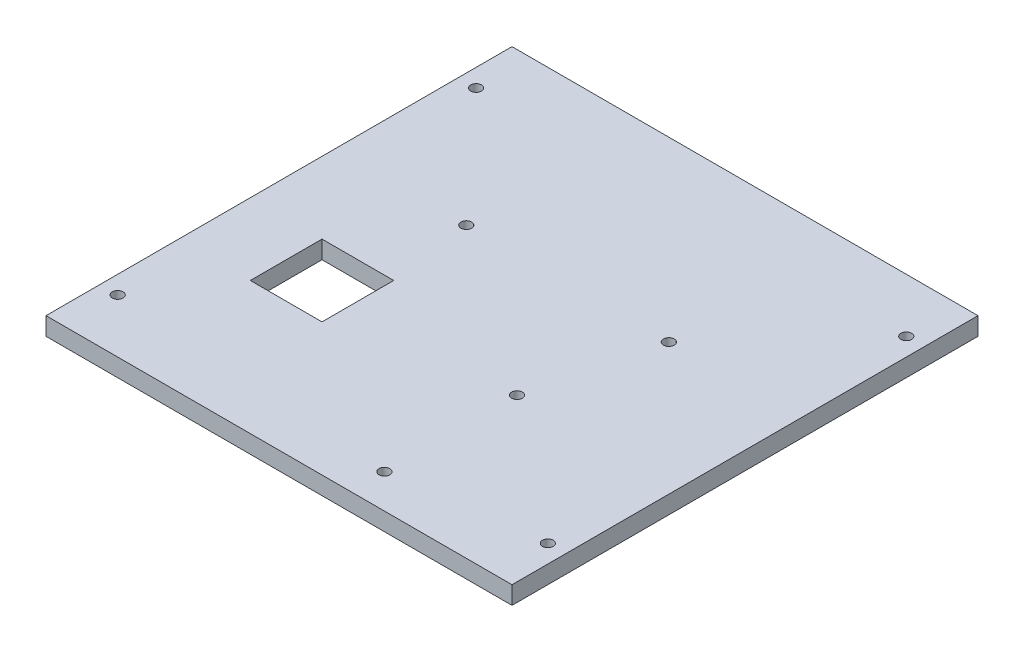
ISO-10303-21;
HEADER;
FILE_DESCRIPTION(('STEP AP214'),'2;1');
FILE_NAME('part.step','',(''),(''),'','','');
FILE_SCHEMA(('AUTOMOTIVE_DESIGN { 1 0 10303 214 1 1 1 1 }'));
ENDSEC;
DATA;
#1=APPLICATION_CONTEXT('core data for automotive mechanical design processes');
#2=APPLICATION_PROTOCOL_DEFINITION('international standard','automotive_design',2000,#1);
#3=PRODUCT_CONTEXT('',#1,'mechanical');
#4=PRODUCT('Part','Part','',(#3));
#5=PRODUCT_RELATED_PRODUCT_CATEGORY('part','',(#4));
#6=PRODUCT_DEFINITION_FORMATION('','',#4);
#7=PRODUCT_DEFINITION_CONTEXT('part definition',#1,'design');
#8=PRODUCT_DEFINITION('design','',#6,#7);
#9=PRODUCT_DEFINITION_SHAPE('','',#8);
#10=(LENGTH_UNIT() NAMED_UNIT(*) SI_UNIT(.MILLI.,.METRE.));
#11=(NAMED_UNIT(*) PLANE_ANGLE_UNIT() SI_UNIT($,.RADIAN.));
#12=(NAMED_UNIT(*) SI_UNIT($,.STERADIAN.) SOLID_ANGLE_UNIT());
#13=UNCERTAINTY_MEASURE_WITH_UNIT(LENGTH_MEASURE(1.E-05),#10,'distance_accuracy_value','');
#14=(GEOMETRIC_REPRESENTATION_CONTEXT(3) GLOBAL_UNCERTAINTY_ASSIGNED_CONTEXT((#13)) GLOBAL_UNIT_ASSIGNED_CONTEXT((#10,
#11,#12)) REPRESENTATION_CONTEXT('',''));
#15=CARTESIAN_POINT('',(0.,0.,0.));
#16=DIRECTION('',(0.,0.,1.));
#17=DIRECTION('',(1.,0.,0.));
#18=AXIS2_PLACEMENT_3D('',#15,#16,#17);
#19=CARTESIAN_POINT('',(65.,5.,-65.));
#20=DIRECTION('',(-1.,0.,0.));
#21=DIRECTION('',(0.,0.,1.));
#22=AXIS2_PLACEMENT_3D('',#19,#20,#21);
#23=PLANE('',#22);
#24=DIRECTION('',(0.,0.,-1.));
#25=VECTOR('',#24,1.);
#26=CARTESIAN_POINT('',(65.,0.,-65.));
#27=LINE('',#26,#25);
#28=CARTESIAN_POINT('',(65.,0.,65.));
#29=VERTEX_POINT('',#28);
#30=CARTESIAN_POINT('',(65.,0.,-65.));
#31=VERTEX_POINT('',#30);
#32=EDGE_CURVE('E172',#29,#31,#27,.T.);
#33=ORIENTED_EDGE('',*,*,#32,.T.);
#34=DIRECTION('',(0.,-1.,0.));
#35=VECTOR('',#34,1.);
#36=CARTESIAN_POINT('',(65.,5.,-65.));
#37=LINE('',#36,#35);
#38=CARTESIAN_POINT('',(65.,5.,-65.));
#39=VERTEX_POINT('',#38);
#40=EDGE_CURVE('E11',#39,#31,#37,.T.);
#41=ORIENTED_EDGE('',*,*,#40,.F.);
#42=DIRECTION('',(0.,0.,-1.));
#43=VECTOR('',#42,1.);
#44=CARTESIAN_POINT('',(65.,5.,-65.));
#45=LINE('',#44,#43);
#46=CARTESIAN_POINT('',(65.,5.,65.));
#47=VERTEX_POINT('',#46);
#48=EDGE_CURVE('E177',#47,#39,#45,.T.);
#49=ORIENTED_EDGE('',*,*,#48,.F.);
#50=DIRECTION('',(0.,-1.,0.));
#51=VECTOR('',#50,1.);
#52=CARTESIAN_POINT('',(65.,5.,65.));
#53=LINE('',#52,#51);
#54=EDGE_CURVE('E187',#47,#29,#53,.T.);
#55=ORIENTED_EDGE('',*,*,#54,.T.);
#56=EDGE_LOOP('',(#33,#41,#49,#55));
#57=FACE_BOUND('',#56,.T.);
#58=ADVANCED_FACE('F33',(#57),#23,.F.);
#59=CARTESIAN_POINT('',(-65.,5.,-65.));
#60=DIRECTION('',(0.,0.,1.));
#61=DIRECTION('',(1.,0.,0.));
#62=AXIS2_PLACEMENT_3D('',#59,#60,#61);
#63=PLANE('',#62);
#64=DIRECTION('',(-1.,0.,0.));
#65=VECTOR('',#64,1.);
#66=CARTESIAN_POINT('',(-65.,0.,-65.));
#67=LINE('',#66,#65);
#68=CARTESIAN_POINT('',(-65.,0.,-65.));
#69=VERTEX_POINT('',#68);
#70=EDGE_CURVE('E190',#31,#69,#67,.T.);
#71=ORIENTED_EDGE('',*,*,#70,.T.);
#72=DIRECTION('',(0.,-1.,0.));
#73=VECTOR('',#72,1.);
#74=CARTESIAN_POINT('',(-65.,5.,-65.));
#75=LINE('',#74,#73);
#76=CARTESIAN_POINT('',(-65.,5.,-65.));
#77=VERTEX_POINT('',#76);
#78=EDGE_CURVE('E40',#77,#69,#75,.T.);
#79=ORIENTED_EDGE('',*,*,#78,.F.);
#80=DIRECTION('',(-1.,0.,0.));
#81=VECTOR('',#80,1.);
#82=CARTESIAN_POINT('',(-65.,5.,-65.));
#83=LINE('',#82,#81);
#84=EDGE_CURVE('E180',#39,#77,#83,.T.);
#85=ORIENTED_EDGE('',*,*,#84,.F.);
#86=ORIENTED_EDGE('',*,*,#40,.T.);
#87=EDGE_LOOP('',(#71,#79,#85,#86));
#88=FACE_BOUND('',#87,.T.);
#89=ADVANCED_FACE('F219',(#88),#63,.F.);
#90=CARTESIAN_POINT('',(-65.,5.,-65.));
#91=DIRECTION('',(1.,0.,0.));
#92=DIRECTION('',(0.,0.,-1.));
#93=AXIS2_PLACEMENT_3D('',#90,#91,#92);
#94=PLANE('',#93);
#95=DIRECTION('',(0.,0.,1.));
#96=VECTOR('',#95,1.);
#97=CARTESIAN_POINT('',(-65.,0.,-65.));
#98=LINE('',#97,#96);
#99=CARTESIAN_POINT('',(-65.,0.,65.));
#100=VERTEX_POINT('',#99);
#101=EDGE_CURVE('E192',#69,#100,#98,.T.);
#102=ORIENTED_EDGE('',*,*,#101,.T.);
#103=DIRECTION('',(0.,-1.,0.));
#104=VECTOR('',#103,1.);
#105=CARTESIAN_POINT('',(-65.,5.,65.));
#106=LINE('',#105,#104);
#107=CARTESIAN_POINT('',(-65.,5.,65.));
#108=VERTEX_POINT('',#107);
#109=EDGE_CURVE('E197',#108,#100,#106,.T.);
#110=ORIENTED_EDGE('',*,*,#109,.F.);
#111=DIRECTION('',(0.,0.,1.));
#112=VECTOR('',#111,1.);
#113=CARTESIAN_POINT('',(-65.,5.,-65.));
#114=LINE('',#113,#112);
#115=EDGE_CURVE('E183',#77,#108,#114,.T.);
#116=ORIENTED_EDGE('',*,*,#115,.F.);
#117=ORIENTED_EDGE('',*,*,#78,.T.);
#118=EDGE_LOOP('',(#102,#110,#116,#117));
#119=FACE_BOUND('',#118,.T.);
#120=ADVANCED_FACE('F204',(#119),#94,.F.);
#121=CARTESIAN_POINT('',(-65.,5.,65.));
#122=DIRECTION('',(0.,0.,-1.));
#123=DIRECTION('',(-1.,0.,0.));
#124=AXIS2_PLACEMENT_3D('',#121,#122,#123);
#125=PLANE('',#124);
#126=DIRECTION('',(1.,0.,0.));
#127=VECTOR('',#126,1.);
#128=CARTESIAN_POINT('',(-65.,0.,65.));
#129=LINE('',#128,#127);
#130=EDGE_CURVE('E181',#100,#29,#129,.T.);
#131=ORIENTED_EDGE('',*,*,#130,.T.);
#132=ORIENTED_EDGE('',*,*,#54,.F.);
#133=DIRECTION('',(1.,0.,0.));
#134=VECTOR('',#133,1.);
#135=CARTESIAN_POINT('',(-65.,5.,65.));
#136=LINE('',#135,#134);
#137=EDGE_CURVE('E185',#108,#47,#136,.T.);
#138=ORIENTED_EDGE('',*,*,#137,.F.);
#139=ORIENTED_EDGE('',*,*,#109,.T.);
#140=EDGE_LOOP('',(#131,#132,#138,#139));
#141=FACE_BOUND('',#140,.T.);
#142=ADVANCED_FACE('F213',(#141),#125,.F.);
#143=CARTESIAN_POINT('',(0.,5.,0.));
#144=DIRECTION('',(0.,1.,0.));
#145=DIRECTION('',(0.,0.,1.));
#146=AXIS2_PLACEMENT_3D('',#143,#144,#145);
#147=PLANE('',#146);
#148=DIRECTION('',(0.,0.,-1.));
#149=VECTOR('',#148,1.);
#150=CARTESIAN_POINT('',(-25.,5.,8.));
#151=LINE('',#150,#149);
#152=CARTESIAN_POINT('',(-25.,5.,28.));
#153=VERTEX_POINT('',#152);
#154=CARTESIAN_POINT('',(-25.,5.,8.));
#155=VERTEX_POINT('',#154);
#156=EDGE_CURVE('E47',#153,#155,#151,.T.);
#157=ORIENTED_EDGE('',*,*,#156,.F.);
#158=DIRECTION('',(1.,0.,0.));
#159=VECTOR('',#158,1.);
#160=CARTESIAN_POINT('',(-45.,5.,28.));
#161=LINE('',#160,#159);
#162=CARTESIAN_POINT('',(-45.,5.,28.));
#163=VERTEX_POINT('',#162);
#164=EDGE_CURVE('E116',#163,#153,#161,.T.);
#165=ORIENTED_EDGE('',*,*,#164,.F.);
#166=DIRECTION('',(0.,0.,1.));
#167=VECTOR('',#166,1.);
#168=CARTESIAN_POINT('',(-45.,5.,8.));
#169=LINE('',#168,#167);
#170=CARTESIAN_POINT('',(-45.,5.,8.));
#171=VERTEX_POINT('',#170);
#172=EDGE_CURVE('E100',#171,#163,#169,.T.);
#173=ORIENTED_EDGE('',*,*,#172,.F.);
#174=DIRECTION('',(-1.,0.,0.));
#175=VECTOR('',#174,1.);
#176=CARTESIAN_POINT('',(-45.,5.,8.));
#177=LINE('',#176,#175);
#178=EDGE_CURVE('E109',#155,#171,#177,.T.);
#179=ORIENTED_EDGE('',*,*,#178,.F.);
#180=EDGE_LOOP('',(#157,#165,#173,#179));
#181=FACE_BOUND('',#180,.T.);
#182=CARTESIAN_POINT('',(-60.,5.,-50.));
#183=DIRECTION('',(0.,1.,0.));
#184=DIRECTION('',(0.,0.,1.));
#185=AXIS2_PLACEMENT_3D('',#182,#183,#184);
#186=CIRCLE('',#185,1.5);
#187=CARTESIAN_POINT('',(-60.,5.,-48.5));
#188=VERTEX_POINT('',#187);
#189=EDGE_CURVE('E135',#188,#188,#186,.T.);
#190=ORIENTED_EDGE('',*,*,#189,.F.);
#191=EDGE_LOOP('',(#190));
#192=FACE_BOUND('',#191,.T.);
#193=CARTESIAN_POINT('',(60.,5.,50.));
#194=DIRECTION('',(0.,1.,0.));
#195=DIRECTION('',(0.,0.,1.));
#196=AXIS2_PLACEMENT_3D('',#193,#194,#195);
#197=CIRCLE('',#196,1.5);
#198=CARTESIAN_POINT('',(60.,5.,51.5));
#199=VERTEX_POINT('',#198);
#200=EDGE_CURVE('E134',#199,#199,#197,.T.);
#201=ORIENTED_EDGE('',*,*,#200,.F.);
#202=EDGE_LOOP('',(#201));
#203=FACE_BOUND('',#202,.T.);
#204=CARTESIAN_POINT('',(-60.,5.,50.));
#205=DIRECTION('',(0.,1.,0.));
#206=DIRECTION('',(0.,0.,-1.));
#207=AXIS2_PLACEMENT_3D('',#204,#205,#206);
#208=CIRCLE('',#207,1.5);
#209=CARTESIAN_POINT('',(-60.,5.,48.5));
#210=VERTEX_POINT('',#209);
#211=EDGE_CURVE('E127',#210,#210,#208,.T.);
#212=ORIENTED_EDGE('',*,*,#211,.F.);
#213=EDGE_LOOP('',(#212));
#214=FACE_BOUND('',#213,.T.);
#215=CARTESIAN_POINT('',(60.,5.,-50.));
#216=DIRECTION('',(0.,1.,0.));
#217=DIRECTION('',(0.,0.,-1.));
#218=AXIS2_PLACEMENT_3D('',#215,#216,#217);
#219=CIRCLE('',#218,1.5);
#220=CARTESIAN_POINT('',(60.,5.,-51.5));
#221=VERTEX_POINT('',#220);
#222=EDGE_CURVE('E142',#221,#221,#219,.T.);
#223=ORIENTED_EDGE('',*,*,#222,.F.);
#224=EDGE_LOOP('',(#223));
#225=FACE_BOUND('',#224,.T.);
#226=CARTESIAN_POINT('',(-28.25,5.,-15.5));
#227=DIRECTION('',(0.,1.,0.));
#228=DIRECTION('',(0.,0.,1.));
#229=AXIS2_PLACEMENT_3D('',#226,#227,#228);
#230=CIRCLE('',#229,1.5);
#231=CARTESIAN_POINT('',(-28.25,5.,-14.));
#232=VERTEX_POINT('',#231);
#233=EDGE_CURVE('E153',#232,#232,#230,.T.);
#234=ORIENTED_EDGE('',*,*,#233,.F.);
#235=EDGE_LOOP('',(#234));
#236=FACE_BOUND('',#235,.T.);
#237=CARTESIAN_POINT('',(28.25,5.,-15.5));
#238=DIRECTION('',(0.,1.,0.));
#239=DIRECTION('',(0.,0.,1.));
#240=AXIS2_PLACEMENT_3D('',#237,#238,#239);
#241=CIRCLE('',#240,1.5);
#242=CARTESIAN_POINT('',(28.25,5.,-14.));
#243=VERTEX_POINT('',#242);
#244=EDGE_CURVE('E152',#243,#243,#241,.T.);
#245=ORIENTED_EDGE('',*,*,#244,.F.);
#246=EDGE_LOOP('',(#245));
#247=FACE_BOUND('',#246,.T.);
#248=CARTESIAN_POINT('',(19.9,5.,55.5));
#249=DIRECTION('',(0.,1.,0.));
#250=DIRECTION('',(0.,0.,1.));
#251=AXIS2_PLACEMENT_3D('',#248,#249,#250);
#252=CIRCLE('',#251,1.50000000000001);
#253=CARTESIAN_POINT('',(19.9,5.,57.));
#254=VERTEX_POINT('',#253);
#255=EDGE_CURVE('E168',#254,#254,#252,.F.);
#256=ORIENTED_EDGE('',*,*,#255,.T.);
#257=EDGE_LOOP('',(#256));
#258=FACE_BOUND('',#257,.T.);
#259=CARTESIAN_POINT('',(19.9,5.,18.5));
#260=DIRECTION('',(0.,1.,0.));
#261=DIRECTION('',(0.,0.,1.));
#262=AXIS2_PLACEMENT_3D('',#259,#260,#261);
#263=CIRCLE('',#262,1.5);
#264=CARTESIAN_POINT('',(19.9,5.,20.));
#265=VERTEX_POINT('',#264);
#266=EDGE_CURVE('E169',#265,#265,#263,.F.);
#267=ORIENTED_EDGE('',*,*,#266,.T.);
#268=EDGE_LOOP('',(#267));
#269=FACE_BOUND('',#268,.T.);
#270=ORIENTED_EDGE('',*,*,#48,.T.);
#271=ORIENTED_EDGE('',*,*,#84,.T.);
#272=ORIENTED_EDGE('',*,*,#115,.T.);
#273=ORIENTED_EDGE('',*,*,#137,.T.);
#274=EDGE_LOOP('',(#270,#271,#272,#273));
#275=FACE_BOUND('',#274,.T.);
#276=ADVANCED_FACE('F113',(#181,#192,#203,#214,#225,#236,#247,#258,#269,#275),#147,.T.);
#277=CARTESIAN_POINT('',(0.,0.,0.));
#278=DIRECTION('',(0.,1.,0.));
#279=DIRECTION('',(0.,0.,1.));
#280=AXIS2_PLACEMENT_3D('',#277,#278,#279);
#281=PLANE('',#280);
#282=DIRECTION('',(-1.,0.,0.));
#283=VECTOR('',#282,1.);
#284=CARTESIAN_POINT('',(-45.,0.,28.));
#285=LINE('',#284,#283);
#286=CARTESIAN_POINT('',(-25.,0.,28.));
#287=VERTEX_POINT('',#286);
#288=CARTESIAN_POINT('',(-45.,0.,28.));
#289=VERTEX_POINT('',#288);
#290=EDGE_CURVE('E280',#287,#289,#285,.T.);
#291=ORIENTED_EDGE('',*,*,#290,.F.);
#292=DIRECTION('',(0.,0.,1.));
#293=VECTOR('',#292,1.);
#294=CARTESIAN_POINT('',(-25.,0.,8.));
#295=LINE('',#294,#293);
#296=CARTESIAN_POINT('',(-25.,0.,8.));
#297=VERTEX_POINT('',#296);
#298=EDGE_CURVE('E128',#297,#287,#295,.T.);
#299=ORIENTED_EDGE('',*,*,#298,.F.);
#300=DIRECTION('',(1.,0.,0.));
#301=VECTOR('',#300,1.);
#302=CARTESIAN_POINT('',(-45.,0.,8.));
#303=LINE('',#302,#301);
#304=CARTESIAN_POINT('',(-45.,0.,8.));
#305=VERTEX_POINT('',#304);
#306=EDGE_CURVE('E125',#305,#297,#303,.T.);
#307=ORIENTED_EDGE('',*,*,#306,.F.);
#308=DIRECTION('',(0.,0.,-1.));
#309=VECTOR('',#308,1.);
#310=CARTESIAN_POINT('',(-45.,0.,8.));
#311=LINE('',#310,#309);
#312=EDGE_CURVE('E103',#289,#305,#311,.T.);
#313=ORIENTED_EDGE('',*,*,#312,.F.);
#314=EDGE_LOOP('',(#291,#299,#307,#313));
#315=FACE_BOUND('',#314,.T.);
#316=CARTESIAN_POINT('',(-60.,0.,-50.));
#317=DIRECTION('',(0.,1.,0.));
#318=DIRECTION('',(0.,0.,1.));
#319=AXIS2_PLACEMENT_3D('',#316,#317,#318);
#320=CIRCLE('',#319,1.5);
#321=CARTESIAN_POINT('',(-60.,0.,-48.5));
#322=VERTEX_POINT('',#321);
#323=EDGE_CURVE('E138',#322,#322,#320,.F.);
#324=ORIENTED_EDGE('',*,*,#323,.F.);
#325=EDGE_LOOP('',(#324));
#326=FACE_BOUND('',#325,.T.);
#327=CARTESIAN_POINT('',(60.,0.,50.));
#328=DIRECTION('',(0.,1.,0.));
#329=DIRECTION('',(0.,0.,1.));
#330=AXIS2_PLACEMENT_3D('',#327,#328,#329);
#331=CIRCLE('',#330,1.5);
#332=CARTESIAN_POINT('',(60.,0.,51.5));
#333=VERTEX_POINT('',#332);
#334=EDGE_CURVE('E139',#333,#333,#331,.F.);
#335=ORIENTED_EDGE('',*,*,#334,.F.);
#336=EDGE_LOOP('',(#335));
#337=FACE_BOUND('',#336,.T.);
#338=CARTESIAN_POINT('',(-60.,0.,50.));
#339=DIRECTION('',(0.,1.,0.));
#340=DIRECTION('',(0.,0.,1.));
#341=AXIS2_PLACEMENT_3D('',#338,#339,#340);
#342=CIRCLE('',#341,1.5);
#343=CARTESIAN_POINT('',(-60.,0.,51.5));
#344=VERTEX_POINT('',#343);
#345=EDGE_CURVE('E131',#344,#344,#342,.F.);
#346=ORIENTED_EDGE('',*,*,#345,.F.);
#347=EDGE_LOOP('',(#346));
#348=FACE_BOUND('',#347,.T.);
#349=CARTESIAN_POINT('',(60.,0.,-50.));
#350=DIRECTION('',(0.,1.,0.));
#351=DIRECTION('',(0.,0.,1.));
#352=AXIS2_PLACEMENT_3D('',#349,#350,#351);
#353=CIRCLE('',#352,1.5);
#354=CARTESIAN_POINT('',(60.,0.,-48.5));
#355=VERTEX_POINT('',#354);
#356=EDGE_CURVE('E149',#355,#355,#353,.F.);
#357=ORIENTED_EDGE('',*,*,#356,.F.);
#358=EDGE_LOOP('',(#357));
#359=FACE_BOUND('',#358,.T.);
#360=CARTESIAN_POINT('',(-28.25,0.,-15.5));
#361=DIRECTION('',(0.,1.,0.));
#362=DIRECTION('',(0.,0.,1.));
#363=AXIS2_PLACEMENT_3D('',#360,#361,#362);
#364=CIRCLE('',#363,1.5);
#365=CARTESIAN_POINT('',(-28.25,0.,-14.));
#366=VERTEX_POINT('',#365);
#367=EDGE_CURVE('E156',#366,#366,#364,.F.);
#368=ORIENTED_EDGE('',*,*,#367,.F.);
#369=EDGE_LOOP('',(#368));
#370=FACE_BOUND('',#369,.T.);
#371=CARTESIAN_POINT('',(28.25,0.,-15.5));
#372=DIRECTION('',(0.,1.,0.));
#373=DIRECTION('',(0.,0.,1.));
#374=AXIS2_PLACEMENT_3D('',#371,#372,#373);
#375=CIRCLE('',#374,1.5);
#376=CARTESIAN_POINT('',(28.25,0.,-14.));
#377=VERTEX_POINT('',#376);
#378=EDGE_CURVE('E157',#377,#377,#375,.F.);
#379=ORIENTED_EDGE('',*,*,#378,.F.);
#380=EDGE_LOOP('',(#379));
#381=FACE_BOUND('',#380,.T.);
#382=CARTESIAN_POINT('',(19.9,0.,55.5));
#383=DIRECTION('',(0.,-1.,0.));
#384=DIRECTION('',(0.,0.,-1.));
#385=AXIS2_PLACEMENT_3D('',#382,#383,#384);
#386=CIRCLE('',#385,1.50000000000001);
#387=CARTESIAN_POINT('',(19.9,0.,54.));
#388=VERTEX_POINT('',#387);
#389=EDGE_CURVE('E165',#388,#388,#386,.T.);
#390=ORIENTED_EDGE('',*,*,#389,.F.);
#391=EDGE_LOOP('',(#390));
#392=FACE_BOUND('',#391,.T.);
#393=CARTESIAN_POINT('',(19.9,0.,18.5));
#394=DIRECTION('',(0.,-1.,0.));
#395=DIRECTION('',(0.,0.,-1.));
#396=AXIS2_PLACEMENT_3D('',#393,#394,#395);
#397=CIRCLE('',#396,1.5);
#398=CARTESIAN_POINT('',(19.9,0.,17.));
#399=VERTEX_POINT('',#398);
#400=EDGE_CURVE('E160',#399,#399,#397,.T.);
#401=ORIENTED_EDGE('',*,*,#400,.F.);
#402=EDGE_LOOP('',(#401));
#403=FACE_BOUND('',#402,.T.);
#404=ORIENTED_EDGE('',*,*,#32,.F.);
#405=ORIENTED_EDGE('',*,*,#130,.F.);
#406=ORIENTED_EDGE('',*,*,#101,.F.);
#407=ORIENTED_EDGE('',*,*,#70,.F.);
#408=EDGE_LOOP('',(#404,#405,#406,#407));
#409=FACE_BOUND('',#408,.T.);
#410=ADVANCED_FACE('F210',(#315,#326,#337,#348,#359,#370,#381,#392,#403,#409),#281,.F.);
#411=CARTESIAN_POINT('',(19.9,9.24264068711931,18.5));
#412=DIRECTION('',(0.,-1.,0.));
#413=DIRECTION('',(0.,0.,-1.));
#414=AXIS2_PLACEMENT_3D('',#411,#412,#413);
#415=CYLINDRICAL_SURFACE('',#414,1.5);
#416=ORIENTED_EDGE('',*,*,#400,.T.);
#417=EDGE_LOOP('',(#416));
#418=FACE_BOUND('',#417,.T.);
#419=ORIENTED_EDGE('',*,*,#266,.F.);
#420=EDGE_LOOP('',(#419));
#421=FACE_BOUND('',#420,.T.);
#422=ADVANCED_FACE('F231',(#418,#421),#415,.F.);
#423=CARTESIAN_POINT('',(19.9,9.24264068711931,55.5));
#424=DIRECTION('',(0.,-1.,0.));
#425=DIRECTION('',(0.,0.,-1.));
#426=AXIS2_PLACEMENT_3D('',#423,#424,#425);
#427=CYLINDRICAL_SURFACE('',#426,1.50000000000001);
#428=ORIENTED_EDGE('',*,*,#389,.T.);
#429=EDGE_LOOP('',(#428));
#430=FACE_BOUND('',#429,.T.);
#431=ORIENTED_EDGE('',*,*,#255,.F.);
#432=EDGE_LOOP('',(#431));
#433=FACE_BOUND('',#432,.T.);
#434=ADVANCED_FACE('F237',(#430,#433),#427,.F.);
#435=CARTESIAN_POINT('',(28.25,-4.24264068711929,-15.5));
#436=DIRECTION('',(0.,1.,0.));
#437=DIRECTION('',(0.,0.,1.));
#438=AXIS2_PLACEMENT_3D('',#435,#436,#437);
#439=CYLINDRICAL_SURFACE('',#438,1.5);
#440=ORIENTED_EDGE('',*,*,#378,.T.);
#441=EDGE_LOOP('',(#440));
#442=FACE_BOUND('',#441,.T.);
#443=ORIENTED_EDGE('',*,*,#244,.T.);
#444=EDGE_LOOP('',(#443));
#445=FACE_BOUND('',#444,.T.);
#446=ADVANCED_FACE('F241',(#442,#445),#439,.F.);
#447=CARTESIAN_POINT('',(-28.25,-4.24264068711929,-15.5));
#448=DIRECTION('',(0.,1.,0.));
#449=DIRECTION('',(0.,0.,1.));
#450=AXIS2_PLACEMENT_3D('',#447,#448,#449);
#451=CYLINDRICAL_SURFACE('',#450,1.5);
#452=ORIENTED_EDGE('',*,*,#367,.T.);
#453=EDGE_LOOP('',(#452));
#454=FACE_BOUND('',#453,.T.);
#455=ORIENTED_EDGE('',*,*,#233,.T.);
#456=EDGE_LOOP('',(#455));
#457=FACE_BOUND('',#456,.T.);
#458=ADVANCED_FACE('F245',(#454,#457),#451,.F.);
#459=CARTESIAN_POINT('',(60.,-4.24264068711927,-50.));
#460=DIRECTION('',(0.,1.,0.));
#461=DIRECTION('',(0.,0.,1.));
#462=AXIS2_PLACEMENT_3D('',#459,#460,#461);
#463=CYLINDRICAL_SURFACE('',#462,1.5);
#464=ORIENTED_EDGE('',*,*,#356,.T.);
#465=EDGE_LOOP('',(#464));
#466=FACE_BOUND('',#465,.T.);
#467=ORIENTED_EDGE('',*,*,#222,.T.);
#468=EDGE_LOOP('',(#467));
#469=FACE_BOUND('',#468,.T.);
#470=ADVANCED_FACE('F249',(#466,#469),#463,.F.);
#471=CARTESIAN_POINT('',(-60.,-4.24264068711927,50.));
#472=DIRECTION('',(0.,1.,0.));
#473=DIRECTION('',(0.,0.,1.));
#474=AXIS2_PLACEMENT_3D('',#471,#472,#473);
#475=CYLINDRICAL_SURFACE('',#474,1.5);
#476=ORIENTED_EDGE('',*,*,#345,.T.);
#477=EDGE_LOOP('',(#476));
#478=FACE_BOUND('',#477,.T.);
#479=ORIENTED_EDGE('',*,*,#211,.T.);
#480=EDGE_LOOP('',(#479));
#481=FACE_BOUND('',#480,.T.);
#482=ADVANCED_FACE('F253',(#478,#481),#475,.F.);
#483=CARTESIAN_POINT('',(60.,-4.24264068711927,50.));
#484=DIRECTION('',(0.,1.,0.));
#485=DIRECTION('',(0.,0.,1.));
#486=AXIS2_PLACEMENT_3D('',#483,#484,#485);
#487=CYLINDRICAL_SURFACE('',#486,1.5);
#488=ORIENTED_EDGE('',*,*,#334,.T.);
#489=EDGE_LOOP('',(#488));
#490=FACE_BOUND('',#489,.T.);
#491=ORIENTED_EDGE('',*,*,#200,.T.);
#492=EDGE_LOOP('',(#491));
#493=FACE_BOUND('',#492,.T.);
#494=ADVANCED_FACE('F255',(#490,#493),#487,.F.);
#495=CARTESIAN_POINT('',(-60.,-4.24264068711927,-50.));
#496=DIRECTION('',(0.,1.,0.));
#497=DIRECTION('',(0.,0.,1.));
#498=AXIS2_PLACEMENT_3D('',#495,#496,#497);
#499=CYLINDRICAL_SURFACE('',#498,1.5);
#500=ORIENTED_EDGE('',*,*,#323,.T.);
#501=EDGE_LOOP('',(#500));
#502=FACE_BOUND('',#501,.T.);
#503=ORIENTED_EDGE('',*,*,#189,.T.);
#504=EDGE_LOOP('',(#503));
#505=FACE_BOUND('',#504,.T.);
#506=ADVANCED_FACE('F258',(#502,#505),#499,.F.);
#507=CARTESIAN_POINT('',(-25.,-28.2842712474619,8.));
#508=DIRECTION('',(1.,0.,0.));
#509=DIRECTION('',(0.,0.,-1.));
#510=AXIS2_PLACEMENT_3D('',#507,#508,#509);
#511=PLANE('',#510);
#512=ORIENTED_EDGE('',*,*,#298,.T.);
#513=DIRECTION('',(0.,1.,0.));
#514=VECTOR('',#513,1.);
#515=CARTESIAN_POINT('',(-25.,-28.2842712474619,28.));
#516=LINE('',#515,#514);
#517=EDGE_CURVE('E121',#287,#153,#516,.T.);
#518=ORIENTED_EDGE('',*,*,#517,.T.);
#519=ORIENTED_EDGE('',*,*,#156,.T.);
#520=DIRECTION('',(0.,1.,0.));
#521=VECTOR('',#520,1.);
#522=CARTESIAN_POINT('',(-25.,-28.2842712474619,8.));
#523=LINE('',#522,#521);
#524=EDGE_CURVE('E106',#297,#155,#523,.T.);
#525=ORIENTED_EDGE('',*,*,#524,.F.);
#526=EDGE_LOOP('',(#512,#518,#519,#525));
#527=FACE_BOUND('',#526,.T.);
#528=ADVANCED_FACE('F262',(#527),#511,.F.);
#529=CARTESIAN_POINT('',(-45.,-28.2842712474619,28.));
#530=DIRECTION('',(0.,0.,1.));
#531=DIRECTION('',(1.,0.,0.));
#532=AXIS2_PLACEMENT_3D('',#529,#530,#531);
#533=PLANE('',#532);
#534=ORIENTED_EDGE('',*,*,#290,.T.);
#535=DIRECTION('',(0.,1.,0.));
#536=VECTOR('',#535,1.);
#537=CARTESIAN_POINT('',(-45.,-28.2842712474619,28.));
#538=LINE('',#537,#536);
#539=EDGE_CURVE('E105',#289,#163,#538,.T.);
#540=ORIENTED_EDGE('',*,*,#539,.T.);
#541=ORIENTED_EDGE('',*,*,#164,.T.);
#542=ORIENTED_EDGE('',*,*,#517,.F.);
#543=EDGE_LOOP('',(#534,#540,#541,#542));
#544=FACE_BOUND('',#543,.T.);
#545=ADVANCED_FACE('F269',(#544),#533,.F.);
#546=CARTESIAN_POINT('',(-45.,-28.2842712474619,8.));
#547=DIRECTION('',(-1.,0.,0.));
#548=DIRECTION('',(0.,0.,1.));
#549=AXIS2_PLACEMENT_3D('',#546,#547,#548);
#550=PLANE('',#549);
#551=ORIENTED_EDGE('',*,*,#312,.T.);
#552=DIRECTION('',(0.,1.,0.));
#553=VECTOR('',#552,1.);
#554=CARTESIAN_POINT('',(-45.,-28.2842712474619,8.));
#555=LINE('',#554,#553);
#556=EDGE_CURVE('E55',#305,#171,#555,.T.);
#557=ORIENTED_EDGE('',*,*,#556,.T.);
#558=ORIENTED_EDGE('',*,*,#172,.T.);
#559=ORIENTED_EDGE('',*,*,#539,.F.);
#560=EDGE_LOOP('',(#551,#557,#558,#559));
#561=FACE_BOUND('',#560,.T.);
#562=ADVANCED_FACE('F97',(#561),#550,.F.);
#563=CARTESIAN_POINT('',(-45.,-28.2842712474619,8.));
#564=DIRECTION('',(0.,0.,-1.));
#565=DIRECTION('',(-1.,0.,0.));
#566=AXIS2_PLACEMENT_3D('',#563,#564,#565);
#567=PLANE('',#566);
#568=ORIENTED_EDGE('',*,*,#306,.T.);
#569=ORIENTED_EDGE('',*,*,#524,.T.);
#570=ORIENTED_EDGE('',*,*,#178,.T.);
#571=ORIENTED_EDGE('',*,*,#556,.F.);
#572=EDGE_LOOP('',(#568,#569,#570,#571));
#573=FACE_BOUND('',#572,.T.);
#574=ADVANCED_FACE('F110',(#573),#567,.F.);
#575=CLOSED_SHELL('',(#58,#89,#120,#142,#276,#410,#422,#434,#446,#458,#470,#482,#494,#506,#528,
#545,#562,#574));
#576=MANIFOLD_SOLID_BREP('B2',#575);
#577=ADVANCED_BREP_SHAPE_REPRESENTATION('',(#18,#576),#14);
#578=SHAPE_DEFINITION_REPRESENTATION(#9,#577);
ENDSEC;
END-ISO-10303-21;
